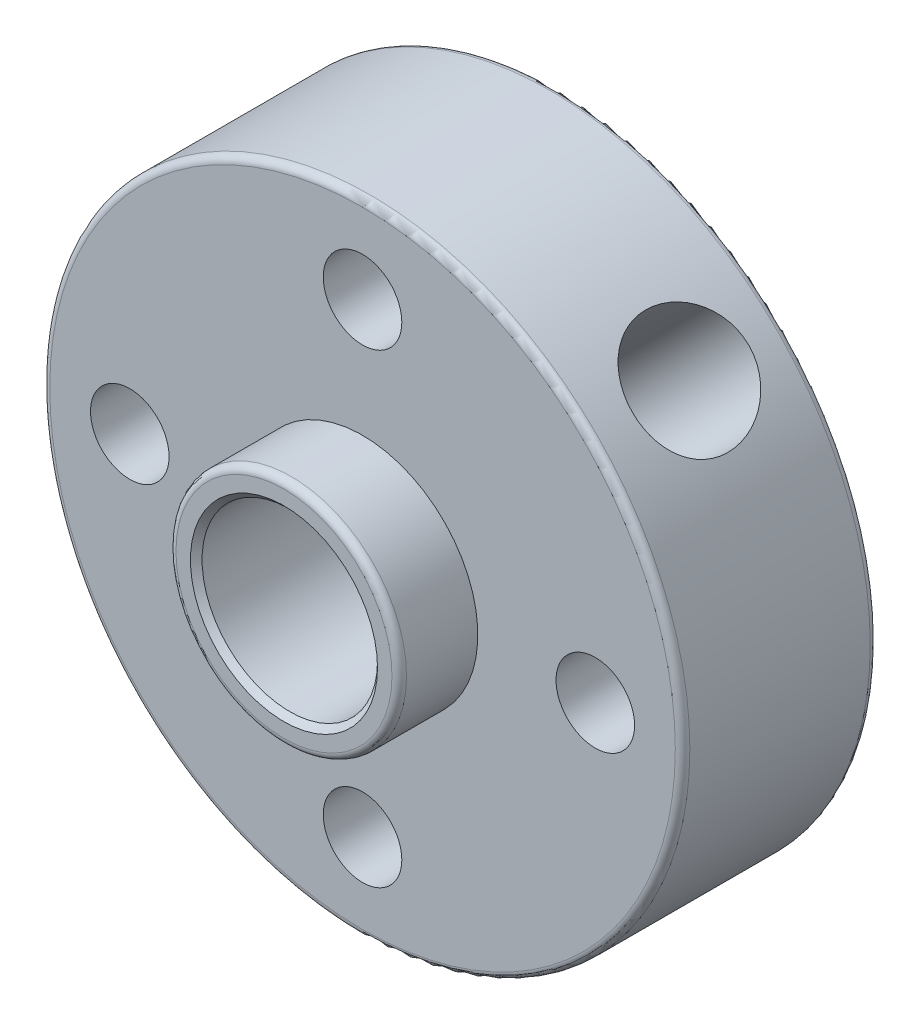
ISO-10303-21;
HEADER;
FILE_DESCRIPTION(('STEP AP214'),'2;1');
FILE_NAME('part.step','',(''),(''),'','','');
FILE_SCHEMA(('AUTOMOTIVE_DESIGN { 1 0 10303 214 1 1 1 1 }'));
ENDSEC;
DATA;
#1=APPLICATION_CONTEXT('core data for automotive mechanical design processes');
#2=APPLICATION_PROTOCOL_DEFINITION('international standard','automotive_design',2000,#1);
#3=PRODUCT_CONTEXT('',#1,'mechanical');
#4=PRODUCT('Part','Part','',(#3));
#5=PRODUCT_RELATED_PRODUCT_CATEGORY('part','',(#4));
#6=PRODUCT_DEFINITION_FORMATION('','',#4);
#7=PRODUCT_DEFINITION_CONTEXT('part definition',#1,'design');
#8=PRODUCT_DEFINITION('design','',#6,#7);
#9=PRODUCT_DEFINITION_SHAPE('','',#8);
#10=(LENGTH_UNIT() NAMED_UNIT(*) SI_UNIT(.MILLI.,.METRE.));
#11=(NAMED_UNIT(*) PLANE_ANGLE_UNIT() SI_UNIT($,.RADIAN.));
#12=(NAMED_UNIT(*) SI_UNIT($,.STERADIAN.) SOLID_ANGLE_UNIT());
#13=UNCERTAINTY_MEASURE_WITH_UNIT(LENGTH_MEASURE(1.E-05),#10,'distance_accuracy_value','');
#14=(GEOMETRIC_REPRESENTATION_CONTEXT(3) GLOBAL_UNCERTAINTY_ASSIGNED_CONTEXT((#13)) GLOBAL_UNIT_ASSIGNED_CONTEXT((#10,
#11,#12)) REPRESENTATION_CONTEXT('',''));
#15=CARTESIAN_POINT('',(0.,0.,0.));
#16=DIRECTION('',(0.,0.,1.));
#17=DIRECTION('',(1.,0.,0.));
#18=AXIS2_PLACEMENT_3D('',#15,#16,#17);
#19=CARTESIAN_POINT('',(0.,0.,0.));
#20=DIRECTION('',(0.,0.,1.));
#21=DIRECTION('',(1.,0.,0.));
#22=AXIS2_PLACEMENT_3D('',#19,#20,#21);
#23=PLANE('',#22);
#24=CARTESIAN_POINT('',(0.,0.,0.));
#25=DIRECTION('',(0.,0.,1.));
#26=DIRECTION('',(1.,0.,0.));
#27=AXIS2_PLACEMENT_3D('',#24,#25,#26);
#28=CIRCLE('',#27,10.75);
#29=CARTESIAN_POINT('',(10.75,0.,0.));
#30=VERTEX_POINT('',#29);
#31=EDGE_CURVE('E43',#30,#30,#28,.T.);
#32=ORIENTED_EDGE('',*,*,#31,.T.);
#33=EDGE_LOOP('',(#32));
#34=FACE_BOUND('',#33,.T.);
#35=CARTESIAN_POINT('',(-8.,0.,0.));
#36=DIRECTION('',(0.,0.,1.));
#37=DIRECTION('',(1.,0.,0.));
#38=AXIS2_PLACEMENT_3D('',#35,#36,#37);
#39=CIRCLE('',#38,1.35);
#40=CARTESIAN_POINT('',(-6.65,0.,0.));
#41=VERTEX_POINT('',#40);
#42=EDGE_CURVE('E101',#41,#41,#39,.T.);
#43=ORIENTED_EDGE('',*,*,#42,.F.);
#44=EDGE_LOOP('',(#43));
#45=FACE_BOUND('',#44,.T.);
#46=CARTESIAN_POINT('',(0.,-8.,0.));
#47=DIRECTION('',(0.,0.,1.));
#48=DIRECTION('',(1.,0.,0.));
#49=AXIS2_PLACEMENT_3D('',#46,#47,#48);
#50=CIRCLE('',#49,1.35);
#51=CARTESIAN_POINT('',(1.35,-8.,0.));
#52=VERTEX_POINT('',#51);
#53=EDGE_CURVE('E143',#52,#52,#50,.T.);
#54=ORIENTED_EDGE('',*,*,#53,.F.);
#55=EDGE_LOOP('',(#54));
#56=FACE_BOUND('',#55,.T.);
#57=CARTESIAN_POINT('',(8.,0.,0.));
#58=DIRECTION('',(0.,0.,1.));
#59=DIRECTION('',(1.,0.,0.));
#60=AXIS2_PLACEMENT_3D('',#57,#58,#59);
#61=CIRCLE('',#60,1.35);
#62=CARTESIAN_POINT('',(9.35,0.,0.));
#63=VERTEX_POINT('',#62);
#64=EDGE_CURVE('E147',#63,#63,#61,.T.);
#65=ORIENTED_EDGE('',*,*,#64,.F.);
#66=EDGE_LOOP('',(#65));
#67=FACE_BOUND('',#66,.T.);
#68=CARTESIAN_POINT('',(0.,8.,0.));
#69=DIRECTION('',(0.,0.,1.));
#70=DIRECTION('',(1.,0.,0.));
#71=AXIS2_PLACEMENT_3D('',#68,#69,#70);
#72=CIRCLE('',#71,1.35);
#73=CARTESIAN_POINT('',(1.35,8.,0.));
#74=VERTEX_POINT('',#73);
#75=EDGE_CURVE('E151',#74,#74,#72,.T.);
#76=ORIENTED_EDGE('',*,*,#75,.F.);
#77=EDGE_LOOP('',(#76));
#78=FACE_BOUND('',#77,.T.);
#79=CARTESIAN_POINT('',(0.,0.,0.));
#80=DIRECTION('',(0.,0.,1.));
#81=DIRECTION('',(1.,0.,0.));
#82=AXIS2_PLACEMENT_3D('',#79,#80,#81);
#83=CIRCLE('',#82,3.9625);
#84=CARTESIAN_POINT('',(-3.9625,0.,0.));
#85=VERTEX_POINT('',#84);
#86=EDGE_CURVE('E70',#85,#85,#83,.T.);
#87=ORIENTED_EDGE('',*,*,#86,.F.);
#88=EDGE_LOOP('',(#87));
#89=FACE_BOUND('',#88,.T.);
#90=ADVANCED_FACE('F32',(#34,#45,#56,#67,#78,#89),#23,.T.);
#91=CARTESIAN_POINT('',(0.,0.,-6.7));
#92=DIRECTION('',(0.,0.,1.));
#93=DIRECTION('',(1.,0.,0.));
#94=AXIS2_PLACEMENT_3D('',#91,#92,#93);
#95=CYLINDRICAL_SURFACE('',#94,11.);
#96=CARTESIAN_POINT('',(0.,0.,-6.45));
#97=DIRECTION('',(0.,0.,1.));
#98=DIRECTION('',(1.,0.,0.));
#99=AXIS2_PLACEMENT_3D('',#96,#97,#98);
#100=CIRCLE('',#99,11.);
#101=CARTESIAN_POINT('',(11.,0.,-6.45));
#102=VERTEX_POINT('',#101);
#103=EDGE_CURVE('E52',#102,#102,#100,.T.);
#104=ORIENTED_EDGE('',*,*,#103,.T.);
#105=EDGE_LOOP('',(#104));
#106=FACE_BOUND('',#105,.T.);
#107=CARTESIAN_POINT('',(0.,0.,-0.25));
#108=DIRECTION('',(0.,0.,1.));
#109=DIRECTION('',(1.,0.,0.));
#110=AXIS2_PLACEMENT_3D('',#107,#108,#109);
#111=CIRCLE('',#110,11.);
#112=CARTESIAN_POINT('',(11.,0.,-0.25));
#113=VERTEX_POINT('',#112);
#114=EDGE_CURVE('E55',#113,#113,#111,.F.);
#115=ORIENTED_EDGE('',*,*,#114,.T.);
#116=EDGE_LOOP('',(#115));
#117=FACE_BOUND('',#116,.T.);
#118=CARTESIAN_POINT('',(9.06274283276228,6.23431570801607,-3.5));
#119=CARTESIAN_POINT('',(9.06274126869769,6.23432027104822,-3.61134012257296));
#120=CARTESIAN_POINT('',(9.05737501848907,6.2421410860834,-3.722737191288));
#121=CARTESIAN_POINT('',(9.03596195833592,6.27309590805742,-3.94239461587297));
#122=CARTESIAN_POINT('',(9.0199058641566,6.29624322611917,-4.05065215966928));
#123=CARTESIAN_POINT('',(8.97731780668885,6.35681727947307,-4.26082031301851));
#124=CARTESIAN_POINT('',(8.95079531574004,6.39423110220744,-4.36273656530805));
#125=CARTESIAN_POINT('',(8.88759547129021,6.48178591134148,-4.55752989162896));
#126=CARTESIAN_POINT('',(8.8509190090296,6.53192578071092,-4.65040775801638));
#127=CARTESIAN_POINT('',(8.76743111229011,6.64357190432209,-4.82558344744175));
#128=CARTESIAN_POINT('',(8.72051740433681,6.70519186738347,-4.90776007423395));
#129=CARTESIAN_POINT('',(8.61744976314321,6.83714524643469,-5.05814556283443));
#130=CARTESIAN_POINT('',(8.56129524088498,6.9074792177927,-5.12635353364538));
#131=CARTESIAN_POINT('',(8.44024267374072,7.05488837497966,-5.24732731845023));
#132=CARTESIAN_POINT('',(8.37528500080819,7.13200815228936,-5.2999792699958));
#133=CARTESIAN_POINT('',(8.23824410809116,7.28987281215714,-5.38761333302614));
#134=CARTESIAN_POINT('',(8.1661614396751,7.3706174139443,-5.42259681050937));
#135=CARTESIAN_POINT('',(8.0173986768152,7.53214687758186,-5.47352723325545));
#136=CARTESIAN_POINT('',(7.94077752664669,7.61292162894229,-5.48967831432072));
#137=CARTESIAN_POINT('',(7.78428207362666,7.77286728708989,-5.5031211674624));
#138=CARTESIAN_POINT('',(7.70440803245135,7.85203832212252,-5.50041445357154));
#139=CARTESIAN_POINT('',(7.5447119680256,8.00558888903868,-5.47637585792208));
#140=CARTESIAN_POINT('',(7.46490041504116,8.08001387686297,-5.45526374648556));
#141=CARTESIAN_POINT('',(7.30685962390046,8.22320989495296,-5.3953608025385));
#142=CARTESIAN_POINT('',(7.2286304409252,8.29198072830029,-5.35656935461377));
#143=CARTESIAN_POINT('',(7.07587117286445,8.42272040524733,-5.26219694022084));
#144=CARTESIAN_POINT('',(7.00136309052324,8.48465093392004,-5.20652735596616));
#145=CARTESIAN_POINT('',(6.85900743192368,8.60014139687727,-5.08004411007532));
#146=CARTESIAN_POINT('',(6.79116049490328,8.65370052809064,-5.00922899706451));
#147=CARTESIAN_POINT('',(6.663600803383,8.75231567621389,-4.85325154542072));
#148=CARTESIAN_POINT('',(6.60401950310794,8.79723789007789,-4.76789698208101));
#149=CARTESIAN_POINT('',(6.49644236590935,8.87697775947045,-4.58590593607908));
#150=CARTESIAN_POINT('',(6.44844667912576,8.91179528405184,-4.48926930723474));
#151=CARTESIAN_POINT('',(6.36592632904784,8.97092946506635,-4.28721748951318));
#152=CARTESIAN_POINT('',(6.33142227207191,8.99523006456892,-4.18178916836021));
#153=CARTESIAN_POINT('',(6.27749146387927,9.03295049879403,-3.96528255011163));
#154=CARTESIAN_POINT('',(6.25806311381759,9.04637148735387,-3.85420485348886));
#155=CARTESIAN_POINT('',(6.23532548196963,9.06205863132706,-3.63124019879459));
#156=CARTESIAN_POINT('',(6.23179147295654,9.06448030890648,-3.51938706733036));
#157=CARTESIAN_POINT('',(6.24038874930699,9.05856360041587,-3.29657544943893));
#158=CARTESIAN_POINT('',(6.25251930860637,9.05022571305954,-3.18561692178604));
#159=CARTESIAN_POINT('',(6.291746476018,9.02299746635386,-2.96861965594772));
#160=CARTESIAN_POINT('',(6.3187271351932,9.00418884914723,-2.86254961599197));
#161=CARTESIAN_POINT('',(6.38642505813139,8.95629855399786,-2.65734028117156));
#162=CARTESIAN_POINT('',(6.42714328121984,8.92721615860706,-2.55820147091432));
#163=CARTESIAN_POINT('',(6.52119009817111,8.85875198536768,-2.36848080398475));
#164=CARTESIAN_POINT('',(6.57465118168705,8.81926150313286,-2.27800388191562));
#165=CARTESIAN_POINT('',(6.69188011288224,8.73064298132519,-2.10926630840225));
#166=CARTESIAN_POINT('',(6.75564882951978,8.68151412913987,-2.03100668800034));
#167=CARTESIAN_POINT('',(6.89202382137046,8.57365993590079,-1.88792715385021));
#168=CARTESIAN_POINT('',(6.96473068693801,8.51482221722215,-1.8232876446382));
#169=CARTESIAN_POINT('',(7.11574154125479,8.38903242708492,-1.710553693917));
#170=CARTESIAN_POINT('',(7.19404532362183,8.32208065476285,-1.66245864272283));
#171=CARTESIAN_POINT('',(7.3531634716617,8.18181938889401,-1.58445196136356));
#172=CARTESIAN_POINT('',(7.43396322974906,8.10854356477782,-1.55445009512347));
#173=CARTESIAN_POINT('',(7.59579996375647,7.9571409319971,-1.51319265670284));
#174=CARTESIAN_POINT('',(7.67683691548015,7.87901460275862,-1.50193523486329));
#175=CARTESIAN_POINT('',(7.83549532828213,7.72122741121697,-1.49854747889448));
#176=CARTESIAN_POINT('',(7.91314916500872,7.64160483389191,-1.50614411151531));
#177=CARTESIAN_POINT('',(8.06412283225127,7.48211096368978,-1.53965294642394));
#178=CARTESIAN_POINT('',(8.1374426990873,7.40223967290293,-1.56556499519901));
#179=CARTESIAN_POINT('',(8.2778477126705,7.2448843005324,-1.63485690348927));
#180=CARTESIAN_POINT('',(8.34494244300898,7.16739667651385,-1.67820934537556));
#181=CARTESIAN_POINT('',(8.47163155171448,7.01720198137938,-1.78111940280876));
#182=CARTESIAN_POINT('',(8.53122546787589,6.94449520499447,-1.84067801627742));
#183=CARTESIAN_POINT('',(8.64261298632904,6.80538750341747,-1.97525763856189));
#184=CARTESIAN_POINT('',(8.69429031455873,6.73908505367216,-2.05047669538433));
#185=CARTESIAN_POINT('',(8.78808424494114,6.61631010218159,-2.21382951669353));
#186=CARTESIAN_POINT('',(8.83019860001533,6.55983991151637,-2.30196630856161));
#187=CARTESIAN_POINT('',(8.90460951689488,6.45847724372725,-2.48955967560111));
#188=CARTESIAN_POINT('',(8.93681836204213,6.41368871247949,-2.58910723931135));
#189=CARTESIAN_POINT('',(8.99049273880686,6.33823336445492,-2.79606327672598));
#190=CARTESIAN_POINT('',(9.01196858165549,6.30755299619202,-2.90346409160781));
#191=CARTESIAN_POINT('',(9.0395308104027,6.2679565387395,-3.09267668443226));
#192=CARTESIAN_POINT('',(9.04822878556571,6.25537055758518,-3.17336926260861));
#193=CARTESIAN_POINT('',(9.05983530203723,6.23854856384096,-3.33603095203218));
#194=CARTESIAN_POINT('',(9.06274398466731,6.23431234742618,-3.41800003206966));
#195=CARTESIAN_POINT('',(9.06274283276228,6.23431570801607,-3.5));
#196=B_SPLINE_CURVE_WITH_KNOTS('',3,(#118,#119,#120,#121,#122,#123,#124,#125,#126,#127,#128,
#129,#130,#131,#132,#133,#134,#135,#136,#137,#138,#139,#140,#141,#142,#143,#144,#145,#146,#147,
#148,#149,#150,#151,#152,#153,#154,#155,#156,#157,#158,#159,#160,#161,#162,#163,#164,#165,#166,
#167,#168,#169,#170,#171,#172,#173,#174,#175,#176,#177,#178,#179,#180,#181,#182,#183,#184,#185,
#186,#187,#188,#189,#190,#191,#192,#193,#194,#195),.UNSPECIFIED.,.T.,.F.,(4,2,2,2,2,2,2,2,2,2,2,
2,2,2,2,2,2,2,2,2,2,2,2,2,2,2,2,2,2,2,2,2,2,2,2,2,2,2,4),(0.,0.333720352628771,
0.667730923425361,1.00143989738151,1.33511959011685,1.6722993511526,2.00950061266478,
2.34911212511978,2.6886973772514,3.02456639415963,3.3604084455173,3.69229445292967,
4.02419201411038,4.35786328487979,4.69156654523441,5.03008350848145,5.36860485839155,
5.70764124486732,6.04664167012788,6.38083364646979,6.71501013332593,7.04661365662176,
7.37824034134339,7.71347820234125,8.04874433945132,8.38820522569594,8.72765360102077,
9.06539473675368,9.40310254298626,9.73594847886932,10.0687916249998,10.4011135484041,
10.7334559397116,11.0702887970716,11.4072007206838,11.7470154829573,12.0865031534681,
12.3322881015162,12.5780670496697),.UNSPECIFIED.);
#197=CARTESIAN_POINT('',(9.06274283276228,6.23431570801607,-3.5));
#198=VERTEX_POINT('',#197);
#199=EDGE_CURVE('E79',#198,#198,#196,.T.);
#200=ORIENTED_EDGE('',*,*,#199,.F.);
#201=EDGE_LOOP('',(#200));
#202=FACE_BOUND('',#201,.T.);
#203=ADVANCED_FACE('F104',(#106,#117,#202),#95,.T.);
#204=CARTESIAN_POINT('',(0.,0.,-6.7));
#205=DIRECTION('',(0.,0.,1.));
#206=DIRECTION('',(1.,0.,0.));
#207=AXIS2_PLACEMENT_3D('',#204,#205,#206);
#208=PLANE('',#207);
#209=CARTESIAN_POINT('',(0.,0.,-6.7));
#210=DIRECTION('',(0.,0.,1.));
#211=DIRECTION('',(1.,0.,0.));
#212=AXIS2_PLACEMENT_3D('',#209,#210,#211);
#213=CIRCLE('',#212,10.75);
#214=CARTESIAN_POINT('',(10.75,0.,-6.7));
#215=VERTEX_POINT('',#214);
#216=EDGE_CURVE('E47',#215,#215,#213,.F.);
#217=ORIENTED_EDGE('',*,*,#216,.T.);
#218=EDGE_LOOP('',(#217));
#219=FACE_BOUND('',#218,.T.);
#220=CARTESIAN_POINT('',(0.,0.,-6.7));
#221=DIRECTION('',(0.,0.,1.));
#222=DIRECTION('',(1.,0.,0.));
#223=AXIS2_PLACEMENT_3D('',#220,#221,#222);
#224=CIRCLE('',#223,3.215);
#225=CARTESIAN_POINT('',(-3.215,0.,-6.7));
#226=VERTEX_POINT('',#225);
#227=EDGE_CURVE('E67',#226,#226,#224,.T.);
#228=ORIENTED_EDGE('',*,*,#227,.T.);
#229=EDGE_LOOP('',(#228));
#230=FACE_BOUND('',#229,.T.);
#231=CARTESIAN_POINT('',(-8.,0.,-6.7));
#232=DIRECTION('',(0.,0.,1.));
#233=DIRECTION('',(1.,0.,0.));
#234=AXIS2_PLACEMENT_3D('',#231,#232,#233);
#235=CIRCLE('',#234,1.35);
#236=CARTESIAN_POINT('',(-6.65,0.,-6.7));
#237=VERTEX_POINT('',#236);
#238=EDGE_CURVE('E102',#237,#237,#235,.T.);
#239=ORIENTED_EDGE('',*,*,#238,.T.);
#240=EDGE_LOOP('',(#239));
#241=FACE_BOUND('',#240,.T.);
#242=CARTESIAN_POINT('',(0.,-8.,-6.7));
#243=DIRECTION('',(0.,0.,1.));
#244=DIRECTION('',(1.,0.,0.));
#245=AXIS2_PLACEMENT_3D('',#242,#243,#244);
#246=CIRCLE('',#245,1.35);
#247=CARTESIAN_POINT('',(1.35,-8.,-6.7));
#248=VERTEX_POINT('',#247);
#249=EDGE_CURVE('E163',#248,#248,#246,.T.);
#250=ORIENTED_EDGE('',*,*,#249,.T.);
#251=EDGE_LOOP('',(#250));
#252=FACE_BOUND('',#251,.T.);
#253=CARTESIAN_POINT('',(8.,0.,-6.7));
#254=DIRECTION('',(0.,0.,1.));
#255=DIRECTION('',(1.,0.,0.));
#256=AXIS2_PLACEMENT_3D('',#253,#254,#255);
#257=CIRCLE('',#256,1.35);
#258=CARTESIAN_POINT('',(9.35,0.,-6.7));
#259=VERTEX_POINT('',#258);
#260=EDGE_CURVE('E160',#259,#259,#257,.T.);
#261=ORIENTED_EDGE('',*,*,#260,.T.);
#262=EDGE_LOOP('',(#261));
#263=FACE_BOUND('',#262,.T.);
#264=CARTESIAN_POINT('',(0.,8.,-6.7));
#265=DIRECTION('',(0.,0.,1.));
#266=DIRECTION('',(1.,0.,0.));
#267=AXIS2_PLACEMENT_3D('',#264,#265,#266);
#268=CIRCLE('',#267,1.35);
#269=CARTESIAN_POINT('',(1.35,8.,-6.7));
#270=VERTEX_POINT('',#269);
#271=EDGE_CURVE('E155',#270,#270,#268,.T.);
#272=ORIENTED_EDGE('',*,*,#271,.T.);
#273=EDGE_LOOP('',(#272));
#274=FACE_BOUND('',#273,.T.);
#275=ADVANCED_FACE('F109',(#219,#230,#241,#252,#263,#274),#208,.F.);
#276=CARTESIAN_POINT('',(0.,0.,2.7));
#277=DIRECTION('',(0.,0.,-1.));
#278=DIRECTION('',(-1.,0.,0.));
#279=AXIS2_PLACEMENT_3D('',#276,#277,#278);
#280=CYLINDRICAL_SURFACE('',#279,3.9625);
#281=CARTESIAN_POINT('',(0.,0.,2.45));
#282=DIRECTION('',(0.,0.,1.));
#283=DIRECTION('',(1.,0.,0.));
#284=AXIS2_PLACEMENT_3D('',#281,#282,#283);
#285=CIRCLE('',#284,3.9625);
#286=CARTESIAN_POINT('',(-3.9625,0.,2.45));
#287=VERTEX_POINT('',#286);
#288=EDGE_CURVE('E10',#287,#287,#285,.F.);
#289=CARTESIAN_POINT('',(-3.9625,0.,2.45));
#290=CARTESIAN_POINT('',(-3.9625,0.,2.42447916666667));
#291=CARTESIAN_POINT('',(-3.9625,0.,2.39895833333333));
#292=CARTESIAN_POINT('',(-3.9625,0.,2.34791666666667));
#293=CARTESIAN_POINT('',(-3.9625,0.,2.32239583333333));
#294=CARTESIAN_POINT('',(-3.9625,0.,2.27135416666667));
#295=CARTESIAN_POINT('',(-3.9625,0.,2.24583333333333));
#296=CARTESIAN_POINT('',(-3.9625,0.,2.19479166666667));
#297=CARTESIAN_POINT('',(-3.9625,0.,2.16927083333333));
#298=CARTESIAN_POINT('',(-3.9625,0.,2.11822916666667));
#299=CARTESIAN_POINT('',(-3.9625,0.,2.09270833333333));
#300=CARTESIAN_POINT('',(-3.9625,0.,2.04166666666667));
#301=CARTESIAN_POINT('',(-3.9625,0.,2.01614583333333));
#302=CARTESIAN_POINT('',(-3.9625,0.,1.96510416666667));
#303=CARTESIAN_POINT('',(-3.9625,0.,1.93958333333333));
#304=CARTESIAN_POINT('',(-3.9625,0.,1.88854166666667));
#305=CARTESIAN_POINT('',(-3.9625,0.,1.86302083333333));
#306=CARTESIAN_POINT('',(-3.9625,0.,1.81197916666667));
#307=CARTESIAN_POINT('',(-3.9625,0.,1.78645833333333));
#308=CARTESIAN_POINT('',(-3.9625,0.,1.73541666666667));
#309=CARTESIAN_POINT('',(-3.9625,0.,1.70989583333333));
#310=CARTESIAN_POINT('',(-3.9625,0.,1.65885416666667));
#311=CARTESIAN_POINT('',(-3.9625,0.,1.63333333333333));
#312=CARTESIAN_POINT('',(-3.9625,0.,1.58229166666667));
#313=CARTESIAN_POINT('',(-3.9625,0.,1.55677083333333));
#314=CARTESIAN_POINT('',(-3.9625,0.,1.50572916666667));
#315=CARTESIAN_POINT('',(-3.9625,0.,1.48020833333333));
#316=CARTESIAN_POINT('',(-3.9625,0.,1.42916666666667));
#317=CARTESIAN_POINT('',(-3.9625,0.,1.40364583333333));
#318=CARTESIAN_POINT('',(-3.9625,0.,1.35260416666667));
#319=CARTESIAN_POINT('',(-3.9625,0.,1.32708333333333));
#320=CARTESIAN_POINT('',(-3.9625,0.,1.27604166666667));
#321=CARTESIAN_POINT('',(-3.9625,0.,1.25052083333333));
#322=CARTESIAN_POINT('',(-3.9625,0.,1.19947916666667));
#323=CARTESIAN_POINT('',(-3.9625,0.,1.17395833333333));
#324=CARTESIAN_POINT('',(-3.9625,0.,1.12291666666667));
#325=CARTESIAN_POINT('',(-3.9625,0.,1.09739583333333));
#326=CARTESIAN_POINT('',(-3.9625,0.,1.04635416666667));
#327=CARTESIAN_POINT('',(-3.9625,0.,1.02083333333333));
#328=CARTESIAN_POINT('',(-3.9625,0.,0.969791666666666));
#329=CARTESIAN_POINT('',(-3.9625,0.,0.944270833333333));
#330=CARTESIAN_POINT('',(-3.9625,0.,0.893229166666666));
#331=CARTESIAN_POINT('',(-3.9625,0.,0.867708333333333));
#332=CARTESIAN_POINT('',(-3.9625,0.,0.816666666666666));
#333=CARTESIAN_POINT('',(-3.9625,0.,0.791145833333333));
#334=CARTESIAN_POINT('',(-3.9625,0.,0.740104166666666));
#335=CARTESIAN_POINT('',(-3.9625,0.,0.714583333333333));
#336=CARTESIAN_POINT('',(-3.9625,0.,0.663541666666666));
#337=CARTESIAN_POINT('',(-3.9625,0.,0.638020833333333));
#338=CARTESIAN_POINT('',(-3.9625,0.,0.586979166666666));
#339=CARTESIAN_POINT('',(-3.9625,0.,0.561458333333333));
#340=CARTESIAN_POINT('',(-3.9625,0.,0.510416666666667));
#341=CARTESIAN_POINT('',(-3.9625,0.,0.484895833333333));
#342=CARTESIAN_POINT('',(-3.9625,0.,0.433854166666666));
#343=CARTESIAN_POINT('',(-3.9625,0.,0.408333333333333));
#344=CARTESIAN_POINT('',(-3.9625,0.,0.357291666666666));
#345=CARTESIAN_POINT('',(-3.9625,0.,0.331770833333333));
#346=CARTESIAN_POINT('',(-3.9625,0.,0.280729166666666));
#347=CARTESIAN_POINT('',(-3.9625,0.,0.255208333333333));
#348=CARTESIAN_POINT('',(-3.9625,0.,0.204166666666666));
#349=CARTESIAN_POINT('',(-3.9625,0.,0.178645833333333));
#350=CARTESIAN_POINT('',(-3.9625,0.,0.127604166666666));
#351=CARTESIAN_POINT('',(-3.9625,0.,0.102083333333333));
#352=CARTESIAN_POINT('',(-3.9625,0.,0.0510416666666661));
#353=CARTESIAN_POINT('',(-3.9625,0.,0.0255208333333328));
#354=CARTESIAN_POINT('',(-3.9625,0.,0.));
#355=B_SPLINE_CURVE_WITH_KNOTS('',3,(#289,#290,#291,#292,#293,#294,#295,#296,#297,#298,#299,
#300,#301,#302,#303,#304,#305,#306,#307,#308,#309,#310,#311,#312,#313,#314,#315,#316,#317,#318,
#319,#320,#321,#322,#323,#324,#325,#326,#327,#328,#329,#330,#331,#332,#333,#334,#335,#336,#337,
#338,#339,#340,#341,#342,#343,#344,#345,#346,#347,#348,#349,#350,#351,#352,#353,#354),
.UNSPECIFIED.,.F.,.F.,(4,2,2,2,2,2,2,2,2,2,2,2,2,2,2,2,2,2,2,2,2,2,2,2,2,2,2,2,2,2,2,2,4),(0.,
0.0765624999999998,0.153125,0.2296875,0.30625,0.3828125,0.459375,0.5359375,0.6125,0.6890625,
0.765625,0.8421875,0.91875,0.9953125,1.071875,1.1484375,1.225,1.3015625,1.378125,1.4546875,
1.53125,1.6078125,1.684375,1.7609375,1.8375,1.9140625,1.990625,2.0671875,2.14375,2.2203125,
2.296875,2.3734375,2.45),.UNSPECIFIED.);
#356=EDGE_CURVE('BSEAM200',#287,#85,#355,.T.);
#357=ORIENTED_EDGE('',*,*,#288,.T.);
#358=ORIENTED_EDGE('',*,*,#86,.T.);
#359=ORIENTED_EDGE('',*,*,#356,.T.);
#360=ORIENTED_EDGE('',*,*,#356,.F.);
#361=EDGE_LOOP('',(#357,#359,#358,#360));
#362=FACE_BOUND('',#361,.T.);
#363=ADVANCED_FACE('F200',(#362),#280,.T.);
#364=CARTESIAN_POINT('',(0.,0.,2.7));
#365=DIRECTION('',(0.,0.,1.));
#366=DIRECTION('',(1.,0.,0.));
#367=AXIS2_PLACEMENT_3D('',#364,#365,#366);
#368=PLANE('',#367);
#369=CARTESIAN_POINT('',(0.,0.,2.7));
#370=DIRECTION('',(0.,0.,1.));
#371=DIRECTION('',(1.,0.,0.));
#372=AXIS2_PLACEMENT_3D('',#369,#370,#371);
#373=CIRCLE('',#372,3.7125);
#374=CARTESIAN_POINT('',(3.7125,0.,2.7));
#375=VERTEX_POINT('',#374);
#376=EDGE_CURVE('E39',#375,#375,#373,.T.);
#377=ORIENTED_EDGE('',*,*,#376,.T.);
#378=EDGE_LOOP('',(#377));
#379=FACE_BOUND('',#378,.T.);
#380=CARTESIAN_POINT('',(0.,0.,2.7));
#381=DIRECTION('',(0.,0.,1.));
#382=DIRECTION('',(1.,0.,0.));
#383=AXIS2_PLACEMENT_3D('',#380,#381,#382);
#384=CIRCLE('',#383,3.215);
#385=CARTESIAN_POINT('',(3.215,0.,2.7));
#386=VERTEX_POINT('',#385);
#387=EDGE_CURVE('E58',#386,#386,#384,.F.);
#388=ORIENTED_EDGE('',*,*,#387,.T.);
#389=EDGE_LOOP('',(#388));
#390=FACE_BOUND('',#389,.T.);
#391=ADVANCED_FACE('F194',(#379,#390),#368,.T.);
#392=CARTESIAN_POINT('',(0.,0.,-6.7));
#393=DIRECTION('',(0.,0.,1.));
#394=DIRECTION('',(1.,0.,0.));
#395=AXIS2_PLACEMENT_3D('',#392,#393,#394);
#396=CYLINDRICAL_SURFACE('',#395,3.015);
#397=CARTESIAN_POINT('',(0.,0.,-6.5));
#398=DIRECTION('',(0.,0.,1.));
#399=DIRECTION('',(1.,0.,0.));
#400=AXIS2_PLACEMENT_3D('',#397,#398,#399);
#401=CIRCLE('',#400,3.015);
#402=CARTESIAN_POINT('',(-3.015,0.,-6.5));
#403=VERTEX_POINT('',#402);
#404=EDGE_CURVE('E61',#403,#403,#401,.F.);
#405=ORIENTED_EDGE('',*,*,#404,.T.);
#406=EDGE_LOOP('',(#405));
#407=FACE_BOUND('',#406,.T.);
#408=CARTESIAN_POINT('',(0.,0.,2.5));
#409=DIRECTION('',(0.,0.,1.));
#410=DIRECTION('',(1.,0.,0.));
#411=AXIS2_PLACEMENT_3D('',#408,#409,#410);
#412=CIRCLE('',#411,3.015);
#413=CARTESIAN_POINT('',(3.015,0.,2.5));
#414=VERTEX_POINT('',#413);
#415=EDGE_CURVE('E64',#414,#414,#412,.T.);
#416=ORIENTED_EDGE('',*,*,#415,.T.);
#417=EDGE_LOOP('',(#416));
#418=FACE_BOUND('',#417,.T.);
#419=CARTESIAN_POINT('',(3.0095544350395,0.181127310293304,-3.5));
#420=CARTESIAN_POINT('',(3.0095576172098,0.181139166048043,-3.5977802713308));
#421=CARTESIAN_POINT('',(3.00901857310506,0.190819868157717,-3.6956004751529));
#422=CARTESIAN_POINT('',(3.00640317198449,0.228228011630767,-3.88775184228037));
#423=CARTESIAN_POINT('',(3.004324059699,0.2559877867209,-3.98207643375698));
#424=CARTESIAN_POINT('',(2.99751439307612,0.326108068928349,-4.16387105142659));
#425=CARTESIAN_POINT('',(2.99280903430165,0.368328380002459,-4.25139734266248));
#426=CARTESIAN_POINT('',(2.97943626215629,0.464249615181342,-4.41950361799456));
#427=CARTESIAN_POINT('',(2.97076799998437,0.517952997494371,-4.50008210956782));
#428=CARTESIAN_POINT('',(2.94639556691898,0.64314839726148,-4.66558947942806));
#429=CARTESIAN_POINT('',(2.92981416930961,0.716106025969348,-4.74928072120872));
#430=CARTESIAN_POINT('',(2.88768658706118,0.870583923770208,-4.90592548024739));
#431=CARTESIAN_POINT('',(2.86213177694261,0.952112378349825,-4.97886856998788));
#432=CARTESIAN_POINT('',(2.79591955989126,1.13295737627133,-5.12228030808943));
#433=CARTESIAN_POINT('',(2.75362955492869,1.23315360225196,-5.19091693105227));
#434=CARTESIAN_POINT('',(2.65317408640701,1.43656070531996,-5.30967888923038));
#435=CARTESIAN_POINT('',(2.59502630411768,1.53976811119172,-5.35982469592116));
#436=CARTESIAN_POINT('',(2.46979438840708,1.73264298764463,-5.43409536096911));
#437=CARTESIAN_POINT('',(2.40442591659406,1.82253863725262,-5.46049565514157));
#438=CARTESIAN_POINT('',(2.26206601015577,1.9964603454516,-5.49435933076879));
#439=CARTESIAN_POINT('',(2.18508913190539,2.08049356490015,-5.50184622288155));
#440=CARTESIAN_POINT('',(2.03469882012237,2.22700781457929,-5.49770819430888));
#441=CARTESIAN_POINT('',(1.96249465612745,2.2908286891514,-5.4887917596269));
#442=CARTESIAN_POINT('',(1.81415322880002,2.41000429586729,-5.45746481466202));
#443=CARTESIAN_POINT('',(1.73801567760131,2.46535840719076,-5.43505331545591));
#444=CARTESIAN_POINT('',(1.58458774905116,2.56665972416982,-5.37794428601875));
#445=CARTESIAN_POINT('',(1.50730213119142,2.61263805546768,-5.34328848723654));
#446=CARTESIAN_POINT('',(1.35359357094973,2.69548550995069,-5.26303067445778));
#447=CARTESIAN_POINT('',(1.27717079143509,2.73235293993626,-5.21742662890331));
#448=CARTESIAN_POINT('',(1.11733495202849,2.80184583601649,-5.10993084375768));
#449=CARTESIAN_POINT('',(1.03431659967988,2.83328405067843,-5.04668837970663));
#450=CARTESIAN_POINT('',(0.874409913513945,2.8866515393389,-4.90921126935961));
#451=CARTESIAN_POINT('',(0.797531303037888,2.90856596532012,-4.83495969932853));
#452=CARTESIAN_POINT('',(0.641520826346633,2.94721366431763,-4.66434155141344));
#453=CARTESIAN_POINT('',(0.563850656609108,2.96263743209954,-4.56632973318428));
#454=CARTESIAN_POINT('',(0.425388952185623,2.98566526479705,-4.35820834300317));
#455=CARTESIAN_POINT('',(0.36456879431872,2.99328265061432,-4.24811973569892));
#456=CARTESIAN_POINT('',(0.280174123735083,3.00216503623404,-4.05040576678851));
#457=CARTESIAN_POINT('',(0.250928505401667,3.00461887194535,-3.96526330778834));
#458=CARTESIAN_POINT('',(0.206924879640653,3.00797376639375,-3.7913316961233));
#459=CARTESIAN_POINT('',(0.192142182879464,3.00887747331543,-3.70254902855323));
#460=CARTESIAN_POINT('',(0.178623421277132,3.00971313721748,-3.52336343240543));
#461=CARTESIAN_POINT('',(0.179954072202489,3.00964105388699,-3.43295531604063));
#462=CARTESIAN_POINT('',(0.19866627617105,3.00846052515087,-3.2537943950379));
#463=CARTESIAN_POINT('',(0.216060954595039,3.00735123226668,-3.16504300456093));
#464=CARTESIAN_POINT('',(0.263877246701767,3.00351909389636,-2.99566559341504));
#465=CARTESIAN_POINT('',(0.293663276416428,3.00087276488276,-2.9148536025095));
#466=CARTESIAN_POINT('',(0.363877890976231,2.99316924641574,-2.75816509459676));
#467=CARTESIAN_POINT('',(0.404310023833468,2.98811125277367,-2.682290233513));
#468=CARTESIAN_POINT('',(0.50262680672319,2.97330167483985,-2.52149081495872));
#469=CARTESIAN_POINT('',(0.56238408953931,2.96281489750891,-2.43778172192202));
#470=CARTESIAN_POINT('',(0.691189473794622,2.93544360346031,-2.27892001869112));
#471=CARTESIAN_POINT('',(0.76024886078663,2.91855126944817,-2.20377801003003));
#472=CARTESIAN_POINT('',(0.920713154696408,2.87243514864054,-2.04771791171277));
#473=CARTESIAN_POINT('',(1.01374055386829,2.8413483051312,-1.96899322130963));
#474=CARTESIAN_POINT('',(1.20588115383605,2.7652709543054,-1.82723964310108));
#475=CARTESIAN_POINT('',(1.3049886834467,2.72029325018906,-1.76419639792196));
#476=CARTESIAN_POINT('',(1.4856527514282,2.62514357861475,-1.6669023860832));
#477=CARTESIAN_POINT('',(1.56689382292273,2.57766160917446,-1.62944059222171));
#478=CARTESIAN_POINT('',(1.7279321574839,2.47258806770661,-1.56802816454738));
#479=CARTESIAN_POINT('',(1.80773058027184,2.41500505434859,-1.54406616410773));
#480=CARTESIAN_POINT('',(1.96340164308346,2.2902539045572,-1.51084780967929));
#481=CARTESIAN_POINT('',(2.03925608114166,2.22304592130044,-1.50165463364414));
#482=CARTESIAN_POINT('',(2.18390756772217,2.08111355480844,-1.49875540753958));
#483=CARTESIAN_POINT('',(2.25270510179716,2.00638968940764,-1.50504829120099));
#484=CARTESIAN_POINT('',(2.37666793303171,1.85752696417113,-1.53173507167735));
#485=CARTESIAN_POINT('',(2.43245039106076,1.78371333101287,-1.55111101674178));
#486=CARTESIAN_POINT('',(2.5352990027496,1.63423429331354,-1.60193470231631));
#487=CARTESIAN_POINT('',(2.58236379241716,1.55856860108707,-1.63338432954923));
#488=CARTESIAN_POINT('',(2.67024003803526,1.403032464042,-1.7093374243122));
#489=CARTESIAN_POINT('',(2.71050289241882,1.32318376237421,-1.75451399032648));
#490=CARTESIAN_POINT('',(2.78168183133235,1.16615490005886,-1.85558073355194));
#491=CARTESIAN_POINT('',(2.81259207059622,1.08897643484851,-1.91147757529523));
#492=CARTESIAN_POINT('',(2.87023720260712,0.927581317542217,-2.04230408740141));
#493=CARTESIAN_POINT('',(2.89555380952428,0.844163095136435,-2.11884420107823));
#494=CARTESIAN_POINT('',(2.93687586597326,0.686739933473947,-2.28338093098542));
#495=CARTESIAN_POINT('',(2.9528748095559,0.612741599648315,-2.37138549979644));
#496=CARTESIAN_POINT('',(2.97660784130768,0.483693433222114,-2.54993407327028));
#497=CARTESIAN_POINT('',(2.98493226609847,0.427563713379298,-2.63961555829131));
#498=CARTESIAN_POINT('',(2.99728791710885,0.330025639847046,-2.82688631249454));
#499=CARTESIAN_POINT('',(3.00132792942862,0.288587275103693,-2.92445895491841));
#500=CARTESIAN_POINT('',(3.00615239133116,0.232119151045078,-3.10175291156321));
#501=CARTESIAN_POINT('',(3.00748259172679,0.213152536005109,-3.18020088115862));
#502=CARTESIAN_POINT('',(3.00918197952225,0.18765593864632,-3.3390911423391));
#503=CARTESIAN_POINT('',(3.00955181628298,0.181117553639165,-3.41953204920424));
#504=CARTESIAN_POINT('',(3.0095544350395,0.181127310293304,-3.5));
#505=B_SPLINE_CURVE_WITH_KNOTS('',3,(#419,#420,#421,#422,#423,#424,#425,#426,#427,#428,#429,
#430,#431,#432,#433,#434,#435,#436,#437,#438,#439,#440,#441,#442,#443,#444,#445,#446,#447,#448,
#449,#450,#451,#452,#453,#454,#455,#456,#457,#458,#459,#460,#461,#462,#463,#464,#465,#466,#467,
#468,#469,#470,#471,#472,#473,#474,#475,#476,#477,#478,#479,#480,#481,#482,#483,#484,#485,#486,
#487,#488,#489,#490,#491,#492,#493,#494,#495,#496,#497,#498,#499,#500,#501,#502,#503,#504),
.UNSPECIFIED.,.T.,.F.,(4,2,2,2,2,2,2,2,2,2,2,2,2,2,2,2,2,2,2,2,2,2,2,2,2,2,2,2,2,2,2,2,2,2,2,2,
2,2,2,2,2,2,4),(0.,0.292973700873795,0.586472818187814,0.877203412045475,1.16799630571131,
1.50352291938288,1.83937293690772,2.22305583300316,2.60631266316467,2.94690023944171,
3.28706423317037,3.57599847193766,3.86495388648803,4.15293382529343,4.44096724304921,
4.76670966542982,5.09295812887378,5.46922667665566,5.84485208085081,6.11395794837982,
6.38260362549697,6.65236198320959,6.92234094666765,7.17990940895318,7.43756381961093,
7.74663291325427,8.05608041284286,8.43161201398594,8.80679851561935,9.10937245875015,
9.41169125687439,9.71529990083176,10.0188876408608,10.301223313052,10.5836031230729,
10.8830197544811,11.1826231327887,11.5292825836093,11.8761837960244,12.1933842993459,
12.509933050117,12.7511979645491,12.99229970241),.UNSPECIFIED.);
#506=CARTESIAN_POINT('',(3.0095544350395,0.181127310293304,-3.5));
#507=VERTEX_POINT('',#506);
#508=EDGE_CURVE('E71',#507,#507,#505,.T.);
#509=ORIENTED_EDGE('',*,*,#508,.T.);
#510=EDGE_LOOP('',(#509));
#511=FACE_BOUND('',#510,.T.);
#512=ADVANCED_FACE('F81',(#407,#418,#511),#396,.F.);
#513=CARTESIAN_POINT('',(0.,8.,-6.7));
#514=DIRECTION('',(0.,0.,1.));
#515=DIRECTION('',(1.,0.,0.));
#516=AXIS2_PLACEMENT_3D('',#513,#514,#515);
#517=CYLINDRICAL_SURFACE('',#516,1.35);
#518=ORIENTED_EDGE('',*,*,#271,.F.);
#519=EDGE_LOOP('',(#518));
#520=FACE_BOUND('',#519,.T.);
#521=ORIENTED_EDGE('',*,*,#75,.T.);
#522=EDGE_LOOP('',(#521));
#523=FACE_BOUND('',#522,.T.);
#524=ADVANCED_FACE('F184',(#520,#523),#517,.F.);
#525=CARTESIAN_POINT('',(8.,0.,-6.7));
#526=DIRECTION('',(0.,0.,1.));
#527=DIRECTION('',(1.,0.,0.));
#528=AXIS2_PLACEMENT_3D('',#525,#526,#527);
#529=CYLINDRICAL_SURFACE('',#528,1.35);
#530=ORIENTED_EDGE('',*,*,#260,.F.);
#531=EDGE_LOOP('',(#530));
#532=FACE_BOUND('',#531,.T.);
#533=ORIENTED_EDGE('',*,*,#64,.T.);
#534=EDGE_LOOP('',(#533));
#535=FACE_BOUND('',#534,.T.);
#536=ADVANCED_FACE('F179',(#532,#535),#529,.F.);
#537=CARTESIAN_POINT('',(0.,-8.,-6.7));
#538=DIRECTION('',(0.,0.,1.));
#539=DIRECTION('',(1.,0.,0.));
#540=AXIS2_PLACEMENT_3D('',#537,#538,#539);
#541=CYLINDRICAL_SURFACE('',#540,1.35);
#542=ORIENTED_EDGE('',*,*,#249,.F.);
#543=EDGE_LOOP('',(#542));
#544=FACE_BOUND('',#543,.T.);
#545=ORIENTED_EDGE('',*,*,#53,.T.);
#546=EDGE_LOOP('',(#545));
#547=FACE_BOUND('',#546,.T.);
#548=ADVANCED_FACE('F175',(#544,#547),#541,.F.);
#549=CARTESIAN_POINT('',(-8.,0.,-6.7));
#550=DIRECTION('',(0.,0.,1.));
#551=DIRECTION('',(1.,0.,0.));
#552=AXIS2_PLACEMENT_3D('',#549,#550,#551);
#553=CYLINDRICAL_SURFACE('',#552,1.35);
#554=ORIENTED_EDGE('',*,*,#238,.F.);
#555=EDGE_LOOP('',(#554));
#556=FACE_BOUND('',#555,.T.);
#557=ORIENTED_EDGE('',*,*,#42,.T.);
#558=EDGE_LOOP('',(#557));
#559=FACE_BOUND('',#558,.T.);
#560=ADVANCED_FACE('F90',(#556,#559),#553,.F.);
#561=CARTESIAN_POINT('',(11.,11.,-3.5));
#562=DIRECTION('',(-0.707106781186549,-0.707106781186546,0.));
#563=DIRECTION('',(0.707106781186546,-0.707106781186549,0.));
#564=AXIS2_PLACEMENT_3D('',#561,#562,#563);
#565=CYLINDRICAL_SURFACE('',#564,2.);
#566=ORIENTED_EDGE('',*,*,#199,.T.);
#567=EDGE_LOOP('',(#566));
#568=FACE_BOUND('',#567,.T.);
#569=ORIENTED_EDGE('',*,*,#508,.F.);
#570=EDGE_LOOP('',(#569));
#571=FACE_BOUND('',#570,.T.);
#572=ADVANCED_FACE('F85',(#568,#571),#565,.F.);
#573=CARTESIAN_POINT('',(0.,0.,-6.7));
#574=DIRECTION('',(0.,0.,-1.));
#575=DIRECTION('',(-1.,0.,0.));
#576=AXIS2_PLACEMENT_3D('',#573,#574,#575);
#577=CONICAL_SURFACE('',#576,3.215,0.785398163397445);
#578=CARTESIAN_POINT('',(-3.015,0.,-6.5));
#579=CARTESIAN_POINT('',(-3.01708333333333,0.,-6.50208333333333));
#580=CARTESIAN_POINT('',(-3.01916666666667,0.,-6.50416666666667));
#581=CARTESIAN_POINT('',(-3.02333333333333,0.,-6.50833333333333));
#582=CARTESIAN_POINT('',(-3.02541666666667,0.,-6.51041666666667));
#583=CARTESIAN_POINT('',(-3.02958333333333,0.,-6.51458333333333));
#584=CARTESIAN_POINT('',(-3.03166666666667,0.,-6.51666666666667));
#585=CARTESIAN_POINT('',(-3.03583333333333,0.,-6.52083333333333));
#586=CARTESIAN_POINT('',(-3.03791666666667,0.,-6.52291666666667));
#587=CARTESIAN_POINT('',(-3.04208333333333,0.,-6.52708333333333));
#588=CARTESIAN_POINT('',(-3.04416666666667,0.,-6.52916666666667));
#589=CARTESIAN_POINT('',(-3.04833333333333,0.,-6.53333333333333));
#590=CARTESIAN_POINT('',(-3.05041666666667,0.,-6.53541666666667));
#591=CARTESIAN_POINT('',(-3.05458333333333,0.,-6.53958333333333));
#592=CARTESIAN_POINT('',(-3.05666666666667,0.,-6.54166666666667));
#593=CARTESIAN_POINT('',(-3.06083333333333,0.,-6.54583333333333));
#594=CARTESIAN_POINT('',(-3.06291666666667,0.,-6.54791666666667));
#595=CARTESIAN_POINT('',(-3.06708333333333,0.,-6.55208333333333));
#596=CARTESIAN_POINT('',(-3.06916666666667,0.,-6.55416666666667));
#597=CARTESIAN_POINT('',(-3.07333333333333,0.,-6.55833333333333));
#598=CARTESIAN_POINT('',(-3.07541666666667,0.,-6.56041666666667));
#599=CARTESIAN_POINT('',(-3.07958333333333,0.,-6.56458333333333));
#600=CARTESIAN_POINT('',(-3.08166666666667,0.,-6.56666666666667));
#601=CARTESIAN_POINT('',(-3.08583333333333,0.,-6.57083333333333));
#602=CARTESIAN_POINT('',(-3.08791666666667,0.,-6.57291666666667));
#603=CARTESIAN_POINT('',(-3.09208333333333,0.,-6.57708333333333));
#604=CARTESIAN_POINT('',(-3.09416666666667,0.,-6.57916666666667));
#605=CARTESIAN_POINT('',(-3.09833333333333,0.,-6.58333333333333));
#606=CARTESIAN_POINT('',(-3.10041666666667,0.,-6.58541666666667));
#607=CARTESIAN_POINT('',(-3.10458333333333,0.,-6.58958333333333));
#608=CARTESIAN_POINT('',(-3.10666666666667,0.,-6.59166666666667));
#609=CARTESIAN_POINT('',(-3.11083333333333,0.,-6.59583333333333));
#610=CARTESIAN_POINT('',(-3.11291666666667,0.,-6.59791666666667));
#611=CARTESIAN_POINT('',(-3.11708333333333,0.,-6.60208333333333));
#612=CARTESIAN_POINT('',(-3.11916666666667,0.,-6.60416666666667));
#613=CARTESIAN_POINT('',(-3.12333333333333,0.,-6.60833333333333));
#614=CARTESIAN_POINT('',(-3.12541666666667,0.,-6.61041666666667));
#615=CARTESIAN_POINT('',(-3.12958333333333,0.,-6.61458333333333));
#616=CARTESIAN_POINT('',(-3.13166666666667,0.,-6.61666666666667));
#617=CARTESIAN_POINT('',(-3.13583333333333,0.,-6.62083333333333));
#618=CARTESIAN_POINT('',(-3.13791666666667,0.,-6.62291666666667));
#619=CARTESIAN_POINT('',(-3.14208333333333,0.,-6.62708333333333));
#620=CARTESIAN_POINT('',(-3.14416666666667,0.,-6.62916666666667));
#621=CARTESIAN_POINT('',(-3.14833333333333,0.,-6.63333333333333));
#622=CARTESIAN_POINT('',(-3.15041666666667,0.,-6.63541666666667));
#623=CARTESIAN_POINT('',(-3.15458333333333,0.,-6.63958333333333));
#624=CARTESIAN_POINT('',(-3.15666666666667,0.,-6.64166666666667));
#625=CARTESIAN_POINT('',(-3.16083333333333,0.,-6.64583333333333));
#626=CARTESIAN_POINT('',(-3.16291666666667,0.,-6.64791666666667));
#627=CARTESIAN_POINT('',(-3.16708333333333,0.,-6.65208333333333));
#628=CARTESIAN_POINT('',(-3.16916666666667,0.,-6.65416666666667));
#629=CARTESIAN_POINT('',(-3.17333333333333,0.,-6.65833333333333));
#630=CARTESIAN_POINT('',(-3.17541666666667,0.,-6.66041666666667));
#631=CARTESIAN_POINT('',(-3.17958333333333,0.,-6.66458333333333));
#632=CARTESIAN_POINT('',(-3.18166666666667,0.,-6.66666666666667));
#633=CARTESIAN_POINT('',(-3.18583333333333,0.,-6.67083333333333));
#634=CARTESIAN_POINT('',(-3.18791666666667,0.,-6.67291666666667));
#635=CARTESIAN_POINT('',(-3.19208333333333,0.,-6.67708333333333));
#636=CARTESIAN_POINT('',(-3.19416666666667,0.,-6.67916666666667));
#637=CARTESIAN_POINT('',(-3.19833333333333,0.,-6.68333333333333));
#638=CARTESIAN_POINT('',(-3.20041666666667,0.,-6.68541666666667));
#639=CARTESIAN_POINT('',(-3.20458333333333,0.,-6.68958333333333));
#640=CARTESIAN_POINT('',(-3.20666666666667,0.,-6.69166666666667));
#641=CARTESIAN_POINT('',(-3.21083333333333,0.,-6.69583333333333));
#642=CARTESIAN_POINT('',(-3.21291666666667,0.,-6.69791666666667));
#643=CARTESIAN_POINT('',(-3.215,0.,-6.7));
#644=B_SPLINE_CURVE_WITH_KNOTS('',3,(#578,#579,#580,#581,#582,#583,#584,#585,#586,#587,#588,
#589,#590,#591,#592,#593,#594,#595,#596,#597,#598,#599,#600,#601,#602,#603,#604,#605,#606,#607,
#608,#609,#610,#611,#612,#613,#614,#615,#616,#617,#618,#619,#620,#621,#622,#623,#624,#625,#626,
#627,#628,#629,#630,#631,#632,#633,#634,#635,#636,#637,#638,#639,#640,#641,#642,#643),
.UNSPECIFIED.,.F.,.F.,(4,2,2,2,2,2,2,2,2,2,2,2,2,2,2,2,2,2,2,2,2,2,2,2,2,2,2,2,2,2,2,2,4),(0.,
0.00883883476483118,0.0176776695296633,0.0265165042944951,0.0353553390593272,0.0441941738241583,
0.0530330085889904,0.0618718433538222,0.0707106781186543,0.0795495128834861,0.0883883476483176,
0.0972271824131494,0.106066017177981,0.114904851942813,0.123743686707645,0.132582521472477,
0.141421356237308,0.15026019100214,0.159099025766972,0.167937860531804,0.176776695296636,
0.185615530061468,0.194454364826299,0.203293199591131,0.212132034355963,0.220970869120795,
0.229809703885627,0.238648538650459,0.24748737341529,0.256326208180122,0.265165042944954,
0.274003877709786,0.282842712474617),.UNSPECIFIED.);
#645=EDGE_CURVE('BSEAM89',#403,#226,#644,.T.);
#646=ORIENTED_EDGE('',*,*,#404,.F.);
#647=ORIENTED_EDGE('',*,*,#227,.F.);
#648=ORIENTED_EDGE('',*,*,#645,.T.);
#649=ORIENTED_EDGE('',*,*,#645,.F.);
#650=EDGE_LOOP('',(#646,#648,#647,#649));
#651=FACE_BOUND('',#650,.T.);
#652=ADVANCED_FACE('F89',(#651),#577,.F.);
#653=CARTESIAN_POINT('',(0.,0.,2.5));
#654=DIRECTION('',(0.,0.,1.));
#655=DIRECTION('',(1.,0.,0.));
#656=AXIS2_PLACEMENT_3D('',#653,#654,#655);
#657=CONICAL_SURFACE('',#656,3.015,0.785398163397445);
#658=ORIENTED_EDGE('',*,*,#387,.F.);
#659=EDGE_LOOP('',(#658));
#660=FACE_BOUND('',#659,.T.);
#661=ORIENTED_EDGE('',*,*,#415,.F.);
#662=EDGE_LOOP('',(#661));
#663=FACE_BOUND('',#662,.T.);
#664=ADVANCED_FACE('F114',(#660,#663),#657,.F.);
#665=CARTESIAN_POINT('',(0.,0.,-6.45));
#666=DIRECTION('',(0.,0.,1.));
#667=DIRECTION('',(1.,0.,0.));
#668=AXIS2_PLACEMENT_3D('',#665,#666,#667);
#669=TOROIDAL_SURFACE('',#668,10.75,0.25);
#670=ORIENTED_EDGE('',*,*,#216,.F.);
#671=EDGE_LOOP('',(#670));
#672=FACE_BOUND('',#671,.T.);
#673=ORIENTED_EDGE('',*,*,#103,.F.);
#674=EDGE_LOOP('',(#673));
#675=FACE_BOUND('',#674,.T.);
#676=ADVANCED_FACE('F118',(#672,#675),#669,.T.);
#677=CARTESIAN_POINT('',(0.,0.,-0.25));
#678=DIRECTION('',(0.,0.,1.));
#679=DIRECTION('',(1.,0.,0.));
#680=AXIS2_PLACEMENT_3D('',#677,#678,#679);
#681=TOROIDAL_SURFACE('',#680,10.75,0.25);
#682=ORIENTED_EDGE('',*,*,#114,.F.);
#683=EDGE_LOOP('',(#682));
#684=FACE_BOUND('',#683,.T.);
#685=ORIENTED_EDGE('',*,*,#31,.F.);
#686=EDGE_LOOP('',(#685));
#687=FACE_BOUND('',#686,.T.);
#688=ADVANCED_FACE('F121',(#684,#687),#681,.T.);
#689=CARTESIAN_POINT('',(0.,0.,2.45));
#690=DIRECTION('',(0.,0.,1.));
#691=DIRECTION('',(1.,0.,0.));
#692=AXIS2_PLACEMENT_3D('',#689,#690,#691);
#693=TOROIDAL_SURFACE('',#692,3.7125,0.25);
#694=ORIENTED_EDGE('',*,*,#288,.F.);
#695=EDGE_LOOP('',(#694));
#696=FACE_BOUND('',#695,.T.);
#697=ORIENTED_EDGE('',*,*,#376,.F.);
#698=EDGE_LOOP('',(#697));
#699=FACE_BOUND('',#698,.T.);
#700=ADVANCED_FACE('F34',(#696,#699),#693,.T.);
#701=CLOSED_SHELL('',(#90,#203,#275,#363,#391,#512,#524,#536,#548,#560,#572,#652,#664,#676,#688,#700));
#702=MANIFOLD_SOLID_BREP('B2',#701);
#703=ADVANCED_BREP_SHAPE_REPRESENTATION('',(#18,#702),#14);
#704=SHAPE_DEFINITION_REPRESENTATION(#9,#703);
ENDSEC;
END-ISO-10303-21;
